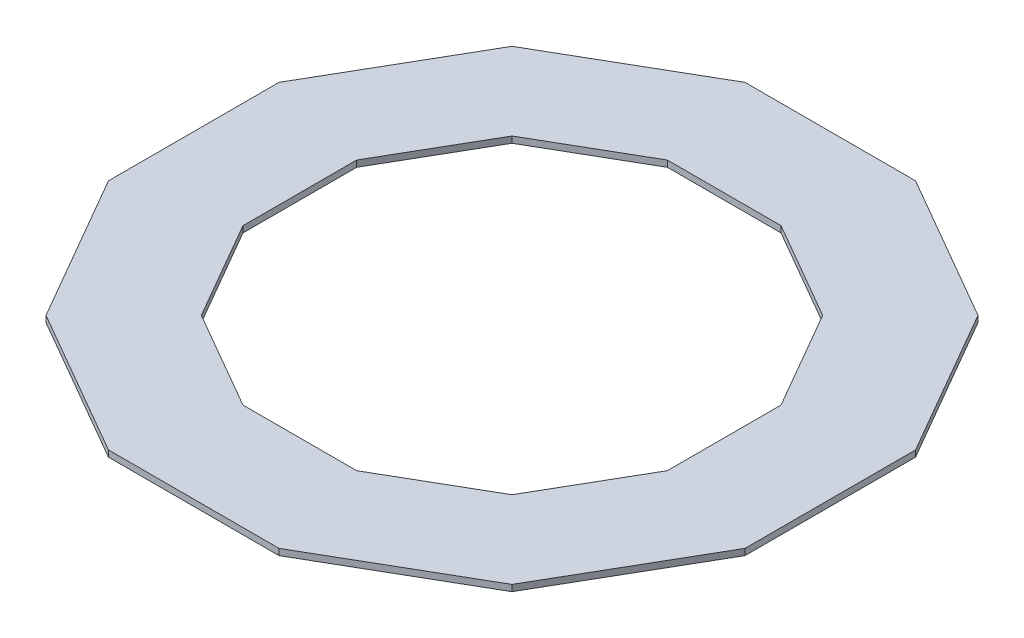
ISO-10303-21;
HEADER;
FILE_DESCRIPTION(('STEP AP214'),'2;1');
FILE_NAME('part.step','',(''),(''),'','','');
FILE_SCHEMA(('AUTOMOTIVE_DESIGN { 1 0 10303 214 1 1 1 1 }'));
ENDSEC;
DATA;
#1=APPLICATION_CONTEXT('core data for automotive mechanical design processes');
#2=APPLICATION_PROTOCOL_DEFINITION('international standard','automotive_design',2000,#1);
#3=PRODUCT_CONTEXT('',#1,'mechanical');
#4=PRODUCT('Part','Part','',(#3));
#5=PRODUCT_RELATED_PRODUCT_CATEGORY('part','',(#4));
#6=PRODUCT_DEFINITION_FORMATION('','',#4);
#7=PRODUCT_DEFINITION_CONTEXT('part definition',#1,'design');
#8=PRODUCT_DEFINITION('design','',#6,#7);
#9=PRODUCT_DEFINITION_SHAPE('','',#8);
#10=(LENGTH_UNIT() NAMED_UNIT(*) SI_UNIT(.MILLI.,.METRE.));
#11=(NAMED_UNIT(*) PLANE_ANGLE_UNIT() SI_UNIT($,.RADIAN.));
#12=(NAMED_UNIT(*) SI_UNIT($,.STERADIAN.) SOLID_ANGLE_UNIT());
#13=UNCERTAINTY_MEASURE_WITH_UNIT(LENGTH_MEASURE(1.E-05),#10,'distance_accuracy_value','');
#14=(GEOMETRIC_REPRESENTATION_CONTEXT(3) GLOBAL_UNCERTAINTY_ASSIGNED_CONTEXT((#13)) GLOBAL_UNIT_ASSIGNED_CONTEXT((#10,
#11,#12)) REPRESENTATION_CONTEXT('',''));
#15=CARTESIAN_POINT('',(0.,0.,0.));
#16=DIRECTION('',(0.,0.,1.));
#17=DIRECTION('',(1.,0.,0.));
#18=AXIS2_PLACEMENT_3D('',#15,#16,#17);
#19=CARTESIAN_POINT('',(0.,-2.921,0.));
#20=DIRECTION('',(0.,1.,0.));
#21=DIRECTION('',(0.,0.,1.));
#22=AXIS2_PLACEMENT_3D('',#19,#20,#21);
#23=PLANE('',#22);
#24=DIRECTION('',(-0.5,0.,-0.866025403784439));
#25=VECTOR('',#24,1.);
#26=CARTESIAN_POINT('',(127.485084689642,-2.921,-73.6035479632271));
#27=LINE('',#26,#25);
#28=CARTESIAN_POINT('',(147.207095926454,-2.921,-39.4440224736242));
#29=VERTEX_POINT('',#28);
#30=CARTESIAN_POINT('',(107.76307345283,-2.921,-107.76307345283));
#31=VERTEX_POINT('',#30);
#32=EDGE_CURVE('E291',#29,#31,#27,.T.);
#33=ORIENTED_EDGE('',*,*,#32,.F.);
#34=DIRECTION('',(0.,0.,-1.));
#35=VECTOR('',#34,1.);
#36=CARTESIAN_POINT('',(147.207095926454,-2.921,0.));
#37=LINE('',#36,#35);
#38=CARTESIAN_POINT('',(147.207095926454,-2.921,39.4440224736242));
#39=VERTEX_POINT('',#38);
#40=EDGE_CURVE('E325',#39,#29,#37,.T.);
#41=ORIENTED_EDGE('',*,*,#40,.F.);
#42=DIRECTION('',(0.5,0.,-0.866025403784439));
#43=VECTOR('',#42,1.);
#44=CARTESIAN_POINT('',(127.485084689642,-2.921,73.6035479632271));
#45=LINE('',#44,#43);
#46=CARTESIAN_POINT('',(107.76307345283,-2.921,107.76307345283));
#47=VERTEX_POINT('',#46);
#48=EDGE_CURVE('E322',#47,#39,#45,.T.);
#49=ORIENTED_EDGE('',*,*,#48,.F.);
#50=DIRECTION('',(0.866025403784439,0.,-0.5));
#51=VECTOR('',#50,1.);
#52=CARTESIAN_POINT('',(73.603547963227,-2.921,127.485084689642));
#53=LINE('',#52,#51);
#54=CARTESIAN_POINT('',(39.4440224736242,-2.921,147.207095926454));
#55=VERTEX_POINT('',#54);
#56=EDGE_CURVE('E319',#55,#47,#53,.T.);
#57=ORIENTED_EDGE('',*,*,#56,.F.);
#58=DIRECTION('',(1.,0.,0.));
#59=VECTOR('',#58,1.);
#60=CARTESIAN_POINT('',(0.,-2.921,147.207095926454));
#61=LINE('',#60,#59);
#62=CARTESIAN_POINT('',(-39.4440224736242,-2.921,147.207095926454));
#63=VERTEX_POINT('',#62);
#64=EDGE_CURVE('E316',#63,#55,#61,.T.);
#65=ORIENTED_EDGE('',*,*,#64,.F.);
#66=DIRECTION('',(0.866025403784439,0.,0.5));
#67=VECTOR('',#66,1.);
#68=CARTESIAN_POINT('',(-73.603547963227,-2.921,127.485084689642));
#69=LINE('',#68,#67);
#70=CARTESIAN_POINT('',(-107.76307345283,-2.921,107.76307345283));
#71=VERTEX_POINT('',#70);
#72=EDGE_CURVE('E313',#71,#63,#69,.T.);
#73=ORIENTED_EDGE('',*,*,#72,.F.);
#74=DIRECTION('',(0.5,0.,0.866025403784439));
#75=VECTOR('',#74,1.);
#76=CARTESIAN_POINT('',(-127.485084689642,-2.921,73.6035479632271));
#77=LINE('',#76,#75);
#78=CARTESIAN_POINT('',(-147.207095926454,-2.921,39.4440224736242));
#79=VERTEX_POINT('',#78);
#80=EDGE_CURVE('E310',#79,#71,#77,.T.);
#81=ORIENTED_EDGE('',*,*,#80,.F.);
#82=DIRECTION('',(0.,0.,1.));
#83=VECTOR('',#82,1.);
#84=CARTESIAN_POINT('',(-147.207095926454,-2.921,0.));
#85=LINE('',#84,#83);
#86=CARTESIAN_POINT('',(-147.207095926454,-2.921,-39.4440224736242));
#87=VERTEX_POINT('',#86);
#88=EDGE_CURVE('E307',#87,#79,#85,.T.);
#89=ORIENTED_EDGE('',*,*,#88,.F.);
#90=DIRECTION('',(-0.5,0.,0.866025403784439));
#91=VECTOR('',#90,1.);
#92=CARTESIAN_POINT('',(-127.485084689642,-2.921,-73.603547963227));
#93=LINE('',#92,#91);
#94=CARTESIAN_POINT('',(-107.76307345283,-2.921,-107.76307345283));
#95=VERTEX_POINT('',#94);
#96=EDGE_CURVE('E304',#95,#87,#93,.T.);
#97=ORIENTED_EDGE('',*,*,#96,.F.);
#98=DIRECTION('',(-0.866025403784439,0.,0.5));
#99=VECTOR('',#98,1.);
#100=CARTESIAN_POINT('',(-73.603547963227,-2.921,-127.485084689642));
#101=LINE('',#100,#99);
#102=CARTESIAN_POINT('',(-39.4440224736242,-2.921,-147.207095926454));
#103=VERTEX_POINT('',#102);
#104=EDGE_CURVE('E301',#103,#95,#101,.T.);
#105=ORIENTED_EDGE('',*,*,#104,.F.);
#106=DIRECTION('',(-1.,0.,0.));
#107=VECTOR('',#106,1.);
#108=CARTESIAN_POINT('',(0.,-2.921,-147.207095926454));
#109=LINE('',#108,#107);
#110=CARTESIAN_POINT('',(39.4440224736242,-2.921,-147.207095926454));
#111=VERTEX_POINT('',#110);
#112=EDGE_CURVE('E298',#111,#103,#109,.T.);
#113=ORIENTED_EDGE('',*,*,#112,.F.);
#114=DIRECTION('',(-0.866025403784439,0.,-0.5));
#115=VECTOR('',#114,1.);
#116=CARTESIAN_POINT('',(73.603547963227,-2.921,-127.485084689642));
#117=LINE('',#116,#115);
#118=EDGE_CURVE('E294',#31,#111,#117,.T.);
#119=ORIENTED_EDGE('',*,*,#118,.F.);
#120=EDGE_LOOP('',(#33,#41,#49,#57,#65,#73,#81,#89,#97,#105,#113,#119));
#121=FACE_BOUND('',#120,.T.);
#122=DIRECTION('',(0.5,0.,-0.866025403784439));
#123=VECTOR('',#122,1.);
#124=CARTESIAN_POINT('',(-84.9900564597613,-2.921,-49.0690319754847));
#125=LINE('',#124,#123);
#126=CARTESIAN_POINT('',(-98.1380639509693,-2.921,-26.2960149824161));
#127=VERTEX_POINT('',#126);
#128=CARTESIAN_POINT('',(-71.8420489685532,-2.921,-71.8420489685532));
#129=VERTEX_POINT('',#128);
#130=EDGE_CURVE('E208',#127,#129,#125,.T.);
#131=ORIENTED_EDGE('',*,*,#130,.F.);
#132=DIRECTION('',(0.,0.,-1.));
#133=VECTOR('',#132,1.);
#134=CARTESIAN_POINT('',(-98.1380639509693,-2.921,0.));
#135=LINE('',#134,#133);
#136=CARTESIAN_POINT('',(-98.1380639509693,-2.921,26.2960149824161));
#137=VERTEX_POINT('',#136);
#138=EDGE_CURVE('E200',#137,#127,#135,.T.);
#139=ORIENTED_EDGE('',*,*,#138,.F.);
#140=DIRECTION('',(-0.5,0.,-0.866025403784439));
#141=VECTOR('',#140,1.);
#142=CARTESIAN_POINT('',(-84.9900564597613,-2.921,49.0690319754847));
#143=LINE('',#142,#141);
#144=CARTESIAN_POINT('',(-71.8420489685532,-2.921,71.8420489685532));
#145=VERTEX_POINT('',#144);
#146=EDGE_CURVE('E207',#145,#137,#143,.T.);
#147=ORIENTED_EDGE('',*,*,#146,.F.);
#148=DIRECTION('',(-0.866025403784439,0.,-0.5));
#149=VECTOR('',#148,1.);
#150=CARTESIAN_POINT('',(-49.0690319754847,-2.921,84.9900564597613));
#151=LINE('',#150,#149);
#152=CARTESIAN_POINT('',(-26.2960149824161,-2.921,98.1380639509694));
#153=VERTEX_POINT('',#152);
#154=EDGE_CURVE('E223',#153,#145,#151,.T.);
#155=ORIENTED_EDGE('',*,*,#154,.F.);
#156=DIRECTION('',(-1.,0.,0.));
#157=VECTOR('',#156,1.);
#158=CARTESIAN_POINT('',(0.,-2.921,98.1380639509694));
#159=LINE('',#158,#157);
#160=CARTESIAN_POINT('',(26.2960149824161,-2.921,98.1380639509694));
#161=VERTEX_POINT('',#160);
#162=EDGE_CURVE('E225',#161,#153,#159,.T.);
#163=ORIENTED_EDGE('',*,*,#162,.F.);
#164=DIRECTION('',(-0.866025403784439,0.,0.5));
#165=VECTOR('',#164,1.);
#166=CARTESIAN_POINT('',(49.0690319754847,-2.921,84.9900564597613));
#167=LINE('',#166,#165);
#168=CARTESIAN_POINT('',(71.8420489685532,-2.921,71.8420489685532));
#169=VERTEX_POINT('',#168);
#170=EDGE_CURVE('E227',#169,#161,#167,.T.);
#171=ORIENTED_EDGE('',*,*,#170,.F.);
#172=DIRECTION('',(-0.5,0.,0.866025403784439));
#173=VECTOR('',#172,1.);
#174=CARTESIAN_POINT('',(84.9900564597613,-2.921,49.0690319754847));
#175=LINE('',#174,#173);
#176=CARTESIAN_POINT('',(98.1380639509694,-2.921,26.2960149824161));
#177=VERTEX_POINT('',#176);
#178=EDGE_CURVE('E229',#177,#169,#175,.T.);
#179=ORIENTED_EDGE('',*,*,#178,.F.);
#180=DIRECTION('',(0.,0.,1.));
#181=VECTOR('',#180,1.);
#182=CARTESIAN_POINT('',(98.1380639509694,-2.921,0.));
#183=LINE('',#182,#181);
#184=CARTESIAN_POINT('',(98.1380639509694,-2.921,-26.2960149824161));
#185=VERTEX_POINT('',#184);
#186=EDGE_CURVE('E231',#185,#177,#183,.T.);
#187=ORIENTED_EDGE('',*,*,#186,.F.);
#188=DIRECTION('',(0.5,0.,0.866025403784439));
#189=VECTOR('',#188,1.);
#190=CARTESIAN_POINT('',(84.9900564597613,-2.921,-49.0690319754847));
#191=LINE('',#190,#189);
#192=CARTESIAN_POINT('',(71.8420489685532,-2.921,-71.8420489685532));
#193=VERTEX_POINT('',#192);
#194=EDGE_CURVE('E233',#193,#185,#191,.T.);
#195=ORIENTED_EDGE('',*,*,#194,.F.);
#196=DIRECTION('',(0.866025403784439,0.,0.5));
#197=VECTOR('',#196,1.);
#198=CARTESIAN_POINT('',(49.0690319754847,-2.921,-84.9900564597613));
#199=LINE('',#198,#197);
#200=CARTESIAN_POINT('',(26.2960149824161,-2.921,-98.1380639509694));
#201=VERTEX_POINT('',#200);
#202=EDGE_CURVE('E235',#201,#193,#199,.T.);
#203=ORIENTED_EDGE('',*,*,#202,.F.);
#204=DIRECTION('',(1.,0.,0.));
#205=VECTOR('',#204,1.);
#206=CARTESIAN_POINT('',(0.,-2.921,-98.1380639509694));
#207=LINE('',#206,#205);
#208=CARTESIAN_POINT('',(-26.2960149824161,-2.921,-98.1380639509694));
#209=VERTEX_POINT('',#208);
#210=EDGE_CURVE('E237',#209,#201,#207,.T.);
#211=ORIENTED_EDGE('',*,*,#210,.F.);
#212=DIRECTION('',(0.866025403784439,0.,-0.5));
#213=VECTOR('',#212,1.);
#214=CARTESIAN_POINT('',(-49.0690319754847,-2.921,-84.9900564597613));
#215=LINE('',#214,#213);
#216=EDGE_CURVE('E212',#129,#209,#215,.T.);
#217=ORIENTED_EDGE('',*,*,#216,.F.);
#218=EDGE_LOOP('',(#131,#139,#147,#155,#163,#171,#179,#187,#195,#203,#211,#217));
#219=FACE_BOUND('',#218,.T.);
#220=ADVANCED_FACE('F38',(#121,#219),#23,.F.);
#221=CARTESIAN_POINT('',(0.,0.,0.));
#222=DIRECTION('',(0.,1.,0.));
#223=DIRECTION('',(0.,0.,1.));
#224=AXIS2_PLACEMENT_3D('',#221,#222,#223);
#225=PLANE('',#224);
#226=DIRECTION('',(-0.5,0.,-0.866025403784439));
#227=VECTOR('',#226,1.);
#228=CARTESIAN_POINT('',(127.485084689642,0.,-73.6035479632271));
#229=LINE('',#228,#227);
#230=CARTESIAN_POINT('',(147.207095926454,0.,-39.4440224736242));
#231=VERTEX_POINT('',#230);
#232=CARTESIAN_POINT('',(107.76307345283,0.,-107.76307345283));
#233=VERTEX_POINT('',#232);
#234=EDGE_CURVE('E271',#231,#233,#229,.T.);
#235=ORIENTED_EDGE('',*,*,#234,.T.);
#236=DIRECTION('',(-0.866025403784439,0.,-0.5));
#237=VECTOR('',#236,1.);
#238=CARTESIAN_POINT('',(73.603547963227,0.,-127.485084689642));
#239=LINE('',#238,#237);
#240=CARTESIAN_POINT('',(39.4440224736242,0.,-147.207095926454));
#241=VERTEX_POINT('',#240);
#242=EDGE_CURVE('E330',#233,#241,#239,.T.);
#243=ORIENTED_EDGE('',*,*,#242,.T.);
#244=DIRECTION('',(-1.,0.,0.));
#245=VECTOR('',#244,1.);
#246=CARTESIAN_POINT('',(0.,0.,-147.207095926454));
#247=LINE('',#246,#245);
#248=CARTESIAN_POINT('',(-39.4440224736242,0.,-147.207095926454));
#249=VERTEX_POINT('',#248);
#250=EDGE_CURVE('E333',#241,#249,#247,.T.);
#251=ORIENTED_EDGE('',*,*,#250,.T.);
#252=DIRECTION('',(-0.866025403784439,0.,0.5));
#253=VECTOR('',#252,1.);
#254=CARTESIAN_POINT('',(-73.603547963227,0.,-127.485084689642));
#255=LINE('',#254,#253);
#256=CARTESIAN_POINT('',(-107.76307345283,0.,-107.76307345283));
#257=VERTEX_POINT('',#256);
#258=EDGE_CURVE('E336',#249,#257,#255,.T.);
#259=ORIENTED_EDGE('',*,*,#258,.T.);
#260=DIRECTION('',(-0.5,0.,0.866025403784439));
#261=VECTOR('',#260,1.);
#262=CARTESIAN_POINT('',(-127.485084689642,0.,-73.603547963227));
#263=LINE('',#262,#261);
#264=CARTESIAN_POINT('',(-147.207095926454,0.,-39.4440224736242));
#265=VERTEX_POINT('',#264);
#266=EDGE_CURVE('E339',#257,#265,#263,.T.);
#267=ORIENTED_EDGE('',*,*,#266,.T.);
#268=DIRECTION('',(0.,0.,1.));
#269=VECTOR('',#268,1.);
#270=CARTESIAN_POINT('',(-147.207095926454,0.,0.));
#271=LINE('',#270,#269);
#272=CARTESIAN_POINT('',(-147.207095926454,0.,39.4440224736242));
#273=VERTEX_POINT('',#272);
#274=EDGE_CURVE('E342',#265,#273,#271,.T.);
#275=ORIENTED_EDGE('',*,*,#274,.T.);
#276=DIRECTION('',(0.5,0.,0.866025403784439));
#277=VECTOR('',#276,1.);
#278=CARTESIAN_POINT('',(-127.485084689642,0.,73.6035479632271));
#279=LINE('',#278,#277);
#280=CARTESIAN_POINT('',(-107.76307345283,0.,107.76307345283));
#281=VERTEX_POINT('',#280);
#282=EDGE_CURVE('E345',#273,#281,#279,.T.);
#283=ORIENTED_EDGE('',*,*,#282,.T.);
#284=DIRECTION('',(0.866025403784439,0.,0.5));
#285=VECTOR('',#284,1.);
#286=CARTESIAN_POINT('',(-73.603547963227,0.,127.485084689642));
#287=LINE('',#286,#285);
#288=CARTESIAN_POINT('',(-39.4440224736242,0.,147.207095926454));
#289=VERTEX_POINT('',#288);
#290=EDGE_CURVE('E348',#281,#289,#287,.T.);
#291=ORIENTED_EDGE('',*,*,#290,.T.);
#292=DIRECTION('',(1.,0.,0.));
#293=VECTOR('',#292,1.);
#294=CARTESIAN_POINT('',(0.,0.,147.207095926454));
#295=LINE('',#294,#293);
#296=CARTESIAN_POINT('',(39.4440224736242,0.,147.207095926454));
#297=VERTEX_POINT('',#296);
#298=EDGE_CURVE('E351',#289,#297,#295,.T.);
#299=ORIENTED_EDGE('',*,*,#298,.T.);
#300=DIRECTION('',(0.866025403784439,0.,-0.5));
#301=VECTOR('',#300,1.);
#302=CARTESIAN_POINT('',(73.603547963227,0.,127.485084689642));
#303=LINE('',#302,#301);
#304=CARTESIAN_POINT('',(107.76307345283,0.,107.76307345283));
#305=VERTEX_POINT('',#304);
#306=EDGE_CURVE('E354',#297,#305,#303,.T.);
#307=ORIENTED_EDGE('',*,*,#306,.T.);
#308=DIRECTION('',(0.5,0.,-0.866025403784439));
#309=VECTOR('',#308,1.);
#310=CARTESIAN_POINT('',(127.485084689642,0.,73.6035479632271));
#311=LINE('',#310,#309);
#312=CARTESIAN_POINT('',(147.207095926454,0.,39.4440224736242));
#313=VERTEX_POINT('',#312);
#314=EDGE_CURVE('E357',#305,#313,#311,.T.);
#315=ORIENTED_EDGE('',*,*,#314,.T.);
#316=DIRECTION('',(0.,0.,-1.));
#317=VECTOR('',#316,1.);
#318=CARTESIAN_POINT('',(147.207095926454,0.,0.));
#319=LINE('',#318,#317);
#320=EDGE_CURVE('E295',#313,#231,#319,.T.);
#321=ORIENTED_EDGE('',*,*,#320,.T.);
#322=EDGE_LOOP('',(#235,#243,#251,#259,#267,#275,#283,#291,#299,#307,#315,#321));
#323=FACE_BOUND('',#322,.T.);
#324=DIRECTION('',(0.,0.,-1.));
#325=VECTOR('',#324,1.);
#326=CARTESIAN_POINT('',(-98.1380639509693,0.,0.));
#327=LINE('',#326,#325);
#328=CARTESIAN_POINT('',(-98.1380639509693,0.,26.2960149824161));
#329=VERTEX_POINT('',#328);
#330=CARTESIAN_POINT('',(-98.1380639509693,0.,-26.2960149824161));
#331=VERTEX_POINT('',#330);
#332=EDGE_CURVE('E241',#329,#331,#327,.T.);
#333=ORIENTED_EDGE('',*,*,#332,.T.);
#334=DIRECTION('',(0.5,0.,-0.866025403784439));
#335=VECTOR('',#334,1.);
#336=CARTESIAN_POINT('',(-84.9900564597613,0.,-49.0690319754847));
#337=LINE('',#336,#335);
#338=CARTESIAN_POINT('',(-71.8420489685532,0.,-71.8420489685532));
#339=VERTEX_POINT('',#338);
#340=EDGE_CURVE('E63',#331,#339,#337,.T.);
#341=ORIENTED_EDGE('',*,*,#340,.T.);
#342=DIRECTION('',(0.866025403784439,0.,-0.5));
#343=VECTOR('',#342,1.);
#344=CARTESIAN_POINT('',(-49.0690319754847,0.,-84.9900564597613));
#345=LINE('',#344,#343);
#346=CARTESIAN_POINT('',(-26.2960149824161,0.,-98.1380639509694));
#347=VERTEX_POINT('',#346);
#348=EDGE_CURVE('E216',#339,#347,#345,.T.);
#349=ORIENTED_EDGE('',*,*,#348,.T.);
#350=DIRECTION('',(1.,0.,0.));
#351=VECTOR('',#350,1.);
#352=CARTESIAN_POINT('',(0.,0.,-98.1380639509694));
#353=LINE('',#352,#351);
#354=CARTESIAN_POINT('',(26.2960149824161,0.,-98.1380639509694));
#355=VERTEX_POINT('',#354);
#356=EDGE_CURVE('E219',#347,#355,#353,.T.);
#357=ORIENTED_EDGE('',*,*,#356,.T.);
#358=DIRECTION('',(0.866025403784439,0.,0.5));
#359=VECTOR('',#358,1.);
#360=CARTESIAN_POINT('',(49.0690319754847,0.,-84.9900564597613));
#361=LINE('',#360,#359);
#362=CARTESIAN_POINT('',(71.8420489685532,0.,-71.8420489685532));
#363=VERTEX_POINT('',#362);
#364=EDGE_CURVE('E264',#355,#363,#361,.T.);
#365=ORIENTED_EDGE('',*,*,#364,.T.);
#366=DIRECTION('',(0.5,0.,0.866025403784439));
#367=VECTOR('',#366,1.);
#368=CARTESIAN_POINT('',(84.9900564597613,0.,-49.0690319754847));
#369=LINE('',#368,#367);
#370=CARTESIAN_POINT('',(98.1380639509694,0.,-26.2960149824161));
#371=VERTEX_POINT('',#370);
#372=EDGE_CURVE('E261',#363,#371,#369,.T.);
#373=ORIENTED_EDGE('',*,*,#372,.T.);
#374=DIRECTION('',(0.,0.,1.));
#375=VECTOR('',#374,1.);
#376=CARTESIAN_POINT('',(98.1380639509694,0.,0.));
#377=LINE('',#376,#375);
#378=CARTESIAN_POINT('',(98.1380639509694,0.,26.2960149824161));
#379=VERTEX_POINT('',#378);
#380=EDGE_CURVE('E258',#371,#379,#377,.T.);
#381=ORIENTED_EDGE('',*,*,#380,.T.);
#382=DIRECTION('',(-0.5,0.,0.866025403784439));
#383=VECTOR('',#382,1.);
#384=CARTESIAN_POINT('',(84.9900564597613,0.,49.0690319754847));
#385=LINE('',#384,#383);
#386=CARTESIAN_POINT('',(71.8420489685532,0.,71.8420489685532));
#387=VERTEX_POINT('',#386);
#388=EDGE_CURVE('E255',#379,#387,#385,.T.);
#389=ORIENTED_EDGE('',*,*,#388,.T.);
#390=DIRECTION('',(-0.866025403784439,0.,0.5));
#391=VECTOR('',#390,1.);
#392=CARTESIAN_POINT('',(49.0690319754847,0.,84.9900564597613));
#393=LINE('',#392,#391);
#394=CARTESIAN_POINT('',(26.2960149824161,0.,98.1380639509694));
#395=VERTEX_POINT('',#394);
#396=EDGE_CURVE('E252',#387,#395,#393,.T.);
#397=ORIENTED_EDGE('',*,*,#396,.T.);
#398=DIRECTION('',(-1.,0.,0.));
#399=VECTOR('',#398,1.);
#400=CARTESIAN_POINT('',(0.,0.,98.1380639509694));
#401=LINE('',#400,#399);
#402=CARTESIAN_POINT('',(-26.2960149824161,0.,98.1380639509694));
#403=VERTEX_POINT('',#402);
#404=EDGE_CURVE('E249',#395,#403,#401,.T.);
#405=ORIENTED_EDGE('',*,*,#404,.T.);
#406=DIRECTION('',(-0.866025403784439,0.,-0.5));
#407=VECTOR('',#406,1.);
#408=CARTESIAN_POINT('',(-49.0690319754847,0.,84.9900564597613));
#409=LINE('',#408,#407);
#410=CARTESIAN_POINT('',(-71.8420489685532,0.,71.8420489685532));
#411=VERTEX_POINT('',#410);
#412=EDGE_CURVE('E246',#403,#411,#409,.T.);
#413=ORIENTED_EDGE('',*,*,#412,.T.);
#414=DIRECTION('',(-0.5,0.,-0.866025403784439));
#415=VECTOR('',#414,1.);
#416=CARTESIAN_POINT('',(-84.9900564597613,0.,49.0690319754847));
#417=LINE('',#416,#415);
#418=EDGE_CURVE('E243',#411,#329,#417,.T.);
#419=ORIENTED_EDGE('',*,*,#418,.T.);
#420=EDGE_LOOP('',(#333,#341,#349,#357,#365,#373,#381,#389,#397,#405,#413,#419));
#421=FACE_BOUND('',#420,.T.);
#422=ADVANCED_FACE('F388',(#323,#421),#225,.T.);
#423=CARTESIAN_POINT('',(127.485084689642,-2.921,-73.6035479632271));
#424=DIRECTION('',(0.866025403784439,0.,-0.5));
#425=DIRECTION('',(-0.5,0.,-0.866025403784439));
#426=AXIS2_PLACEMENT_3D('',#423,#424,#425);
#427=PLANE('',#426);
#428=ORIENTED_EDGE('',*,*,#234,.F.);
#429=DIRECTION('',(0.,1.,0.));
#430=VECTOR('',#429,1.);
#431=CARTESIAN_POINT('',(147.207095926454,-2.921,-39.4440224736242));
#432=LINE('',#431,#430);
#433=EDGE_CURVE('E11',#29,#231,#432,.T.);
#434=ORIENTED_EDGE('',*,*,#433,.F.);
#435=ORIENTED_EDGE('',*,*,#32,.T.);
#436=DIRECTION('',(0.,1.,0.));
#437=VECTOR('',#436,1.);
#438=CARTESIAN_POINT('',(107.76307345283,-2.921,-107.76307345283));
#439=LINE('',#438,#437);
#440=EDGE_CURVE('E42',#31,#233,#439,.T.);
#441=ORIENTED_EDGE('',*,*,#440,.T.);
#442=EDGE_LOOP('',(#428,#434,#435,#441));
#443=FACE_BOUND('',#442,.T.);
#444=ADVANCED_FACE('F40',(#443),#427,.T.);
#445=CARTESIAN_POINT('',(147.207095926454,-2.921,0.));
#446=DIRECTION('',(1.,0.,0.));
#447=DIRECTION('',(0.,0.,-1.));
#448=AXIS2_PLACEMENT_3D('',#445,#446,#447);
#449=PLANE('',#448);
#450=ORIENTED_EDGE('',*,*,#320,.F.);
#451=DIRECTION('',(0.,1.,0.));
#452=VECTOR('',#451,1.);
#453=CARTESIAN_POINT('',(147.207095926454,-2.921,39.4440224736242));
#454=LINE('',#453,#452);
#455=EDGE_CURVE('E47',#39,#313,#454,.T.);
#456=ORIENTED_EDGE('',*,*,#455,.F.);
#457=ORIENTED_EDGE('',*,*,#40,.T.);
#458=ORIENTED_EDGE('',*,*,#433,.T.);
#459=EDGE_LOOP('',(#450,#456,#457,#458));
#460=FACE_BOUND('',#459,.T.);
#461=ADVANCED_FACE('F393',(#460),#449,.T.);
#462=CARTESIAN_POINT('',(127.485084689642,-2.921,73.6035479632271));
#463=DIRECTION('',(0.866025403784439,0.,0.5));
#464=DIRECTION('',(0.5,0.,-0.866025403784439));
#465=AXIS2_PLACEMENT_3D('',#462,#463,#464);
#466=PLANE('',#465);
#467=ORIENTED_EDGE('',*,*,#314,.F.);
#468=DIRECTION('',(0.,1.,0.));
#469=VECTOR('',#468,1.);
#470=CARTESIAN_POINT('',(107.76307345283,-2.921,107.76307345283));
#471=LINE('',#470,#469);
#472=EDGE_CURVE('E363',#47,#305,#471,.T.);
#473=ORIENTED_EDGE('',*,*,#472,.F.);
#474=ORIENTED_EDGE('',*,*,#48,.T.);
#475=ORIENTED_EDGE('',*,*,#455,.T.);
#476=EDGE_LOOP('',(#467,#473,#474,#475));
#477=FACE_BOUND('',#476,.T.);
#478=ADVANCED_FACE('F429',(#477),#466,.T.);
#479=CARTESIAN_POINT('',(73.603547963227,-2.921,127.485084689642));
#480=DIRECTION('',(0.5,0.,0.866025403784439));
#481=DIRECTION('',(0.866025403784439,0.,-0.5));
#482=AXIS2_PLACEMENT_3D('',#479,#480,#481);
#483=PLANE('',#482);
#484=ORIENTED_EDGE('',*,*,#306,.F.);
#485=DIRECTION('',(0.,1.,0.));
#486=VECTOR('',#485,1.);
#487=CARTESIAN_POINT('',(39.4440224736242,-2.921,147.207095926454));
#488=LINE('',#487,#486);
#489=EDGE_CURVE('E365',#55,#297,#488,.T.);
#490=ORIENTED_EDGE('',*,*,#489,.F.);
#491=ORIENTED_EDGE('',*,*,#56,.T.);
#492=ORIENTED_EDGE('',*,*,#472,.T.);
#493=EDGE_LOOP('',(#484,#490,#491,#492));
#494=FACE_BOUND('',#493,.T.);
#495=ADVANCED_FACE('F426',(#494),#483,.T.);
#496=CARTESIAN_POINT('',(0.,-2.921,147.207095926454));
#497=DIRECTION('',(0.,0.,1.));
#498=DIRECTION('',(1.,0.,0.));
#499=AXIS2_PLACEMENT_3D('',#496,#497,#498);
#500=PLANE('',#499);
#501=ORIENTED_EDGE('',*,*,#298,.F.);
#502=DIRECTION('',(0.,1.,0.));
#503=VECTOR('',#502,1.);
#504=CARTESIAN_POINT('',(-39.4440224736242,-2.921,147.207095926454));
#505=LINE('',#504,#503);
#506=EDGE_CURVE('E367',#63,#289,#505,.T.);
#507=ORIENTED_EDGE('',*,*,#506,.F.);
#508=ORIENTED_EDGE('',*,*,#64,.T.);
#509=ORIENTED_EDGE('',*,*,#489,.T.);
#510=EDGE_LOOP('',(#501,#507,#508,#509));
#511=FACE_BOUND('',#510,.T.);
#512=ADVANCED_FACE('F423',(#511),#500,.T.);
#513=CARTESIAN_POINT('',(-73.603547963227,-2.921,127.485084689642));
#514=DIRECTION('',(-0.5,0.,0.866025403784439));
#515=DIRECTION('',(0.866025403784439,0.,0.5));
#516=AXIS2_PLACEMENT_3D('',#513,#514,#515);
#517=PLANE('',#516);
#518=ORIENTED_EDGE('',*,*,#290,.F.);
#519=DIRECTION('',(0.,1.,0.));
#520=VECTOR('',#519,1.);
#521=CARTESIAN_POINT('',(-107.76307345283,-2.921,107.76307345283));
#522=LINE('',#521,#520);
#523=EDGE_CURVE('E369',#71,#281,#522,.T.);
#524=ORIENTED_EDGE('',*,*,#523,.F.);
#525=ORIENTED_EDGE('',*,*,#72,.T.);
#526=ORIENTED_EDGE('',*,*,#506,.T.);
#527=EDGE_LOOP('',(#518,#524,#525,#526));
#528=FACE_BOUND('',#527,.T.);
#529=ADVANCED_FACE('F419',(#528),#517,.T.);
#530=CARTESIAN_POINT('',(-127.485084689642,-2.921,73.6035479632271));
#531=DIRECTION('',(-0.866025403784439,0.,0.5));
#532=DIRECTION('',(0.5,0.,0.866025403784439));
#533=AXIS2_PLACEMENT_3D('',#530,#531,#532);
#534=PLANE('',#533);
#535=ORIENTED_EDGE('',*,*,#282,.F.);
#536=DIRECTION('',(0.,1.,0.));
#537=VECTOR('',#536,1.);
#538=CARTESIAN_POINT('',(-147.207095926454,-2.921,39.4440224736242));
#539=LINE('',#538,#537);
#540=EDGE_CURVE('E371',#79,#273,#539,.T.);
#541=ORIENTED_EDGE('',*,*,#540,.F.);
#542=ORIENTED_EDGE('',*,*,#80,.T.);
#543=ORIENTED_EDGE('',*,*,#523,.T.);
#544=EDGE_LOOP('',(#535,#541,#542,#543));
#545=FACE_BOUND('',#544,.T.);
#546=ADVANCED_FACE('F415',(#545),#534,.T.);
#547=CARTESIAN_POINT('',(-147.207095926454,-2.921,0.));
#548=DIRECTION('',(-1.,0.,0.));
#549=DIRECTION('',(0.,0.,1.));
#550=AXIS2_PLACEMENT_3D('',#547,#548,#549);
#551=PLANE('',#550);
#552=ORIENTED_EDGE('',*,*,#274,.F.);
#553=DIRECTION('',(0.,1.,0.));
#554=VECTOR('',#553,1.);
#555=CARTESIAN_POINT('',(-147.207095926454,-2.921,-39.4440224736242));
#556=LINE('',#555,#554);
#557=EDGE_CURVE('E373',#87,#265,#556,.T.);
#558=ORIENTED_EDGE('',*,*,#557,.F.);
#559=ORIENTED_EDGE('',*,*,#88,.T.);
#560=ORIENTED_EDGE('',*,*,#540,.T.);
#561=EDGE_LOOP('',(#552,#558,#559,#560));
#562=FACE_BOUND('',#561,.T.);
#563=ADVANCED_FACE('F411',(#562),#551,.T.);
#564=CARTESIAN_POINT('',(-127.485084689642,-2.921,-73.603547963227));
#565=DIRECTION('',(-0.866025403784439,0.,-0.5));
#566=DIRECTION('',(-0.5,0.,0.866025403784439));
#567=AXIS2_PLACEMENT_3D('',#564,#565,#566);
#568=PLANE('',#567);
#569=ORIENTED_EDGE('',*,*,#266,.F.);
#570=DIRECTION('',(0.,1.,0.));
#571=VECTOR('',#570,1.);
#572=CARTESIAN_POINT('',(-107.76307345283,-2.921,-107.76307345283));
#573=LINE('',#572,#571);
#574=EDGE_CURVE('E375',#95,#257,#573,.T.);
#575=ORIENTED_EDGE('',*,*,#574,.F.);
#576=ORIENTED_EDGE('',*,*,#96,.T.);
#577=ORIENTED_EDGE('',*,*,#557,.T.);
#578=EDGE_LOOP('',(#569,#575,#576,#577));
#579=FACE_BOUND('',#578,.T.);
#580=ADVANCED_FACE('F407',(#579),#568,.T.);
#581=CARTESIAN_POINT('',(-73.603547963227,-2.921,-127.485084689642));
#582=DIRECTION('',(-0.5,0.,-0.866025403784439));
#583=DIRECTION('',(-0.866025403784439,0.,0.5));
#584=AXIS2_PLACEMENT_3D('',#581,#582,#583);
#585=PLANE('',#584);
#586=ORIENTED_EDGE('',*,*,#258,.F.);
#587=DIRECTION('',(0.,1.,0.));
#588=VECTOR('',#587,1.);
#589=CARTESIAN_POINT('',(-39.4440224736242,-2.921,-147.207095926454));
#590=LINE('',#589,#588);
#591=EDGE_CURVE('E377',#103,#249,#590,.T.);
#592=ORIENTED_EDGE('',*,*,#591,.F.);
#593=ORIENTED_EDGE('',*,*,#104,.T.);
#594=ORIENTED_EDGE('',*,*,#574,.T.);
#595=EDGE_LOOP('',(#586,#592,#593,#594));
#596=FACE_BOUND('',#595,.T.);
#597=ADVANCED_FACE('F405',(#596),#585,.T.);
#598=CARTESIAN_POINT('',(0.,-2.921,-147.207095926454));
#599=DIRECTION('',(0.,0.,-1.));
#600=DIRECTION('',(-1.,0.,0.));
#601=AXIS2_PLACEMENT_3D('',#598,#599,#600);
#602=PLANE('',#601);
#603=ORIENTED_EDGE('',*,*,#250,.F.);
#604=DIRECTION('',(0.,1.,0.));
#605=VECTOR('',#604,1.);
#606=CARTESIAN_POINT('',(39.4440224736242,-2.921,-147.207095926454));
#607=LINE('',#606,#605);
#608=EDGE_CURVE('E378',#111,#241,#607,.T.);
#609=ORIENTED_EDGE('',*,*,#608,.F.);
#610=ORIENTED_EDGE('',*,*,#112,.T.);
#611=ORIENTED_EDGE('',*,*,#591,.T.);
#612=EDGE_LOOP('',(#603,#609,#610,#611));
#613=FACE_BOUND('',#612,.T.);
#614=ADVANCED_FACE('F401',(#613),#602,.T.);
#615=CARTESIAN_POINT('',(73.603547963227,-2.921,-127.485084689642));
#616=DIRECTION('',(0.5,0.,-0.866025403784439));
#617=DIRECTION('',(-0.866025403784439,0.,-0.5));
#618=AXIS2_PLACEMENT_3D('',#615,#616,#617);
#619=PLANE('',#618);
#620=ORIENTED_EDGE('',*,*,#242,.F.);
#621=ORIENTED_EDGE('',*,*,#440,.F.);
#622=ORIENTED_EDGE('',*,*,#118,.T.);
#623=ORIENTED_EDGE('',*,*,#608,.T.);
#624=EDGE_LOOP('',(#620,#621,#622,#623));
#625=FACE_BOUND('',#624,.T.);
#626=ADVANCED_FACE('F386',(#625),#619,.T.);
#627=CARTESIAN_POINT('',(-84.9900564597613,-2.921,-49.0690319754847));
#628=DIRECTION('',(0.866025403784439,0.,0.5));
#629=DIRECTION('',(0.5,0.,-0.866025403784439));
#630=AXIS2_PLACEMENT_3D('',#627,#628,#629);
#631=PLANE('',#630);
#632=ORIENTED_EDGE('',*,*,#340,.F.);
#633=DIRECTION('',(0.,1.,0.));
#634=VECTOR('',#633,1.);
#635=CARTESIAN_POINT('',(-98.1380639509693,-2.921,-26.2960149824161));
#636=LINE('',#635,#634);
#637=EDGE_CURVE('E202',#127,#331,#636,.T.);
#638=ORIENTED_EDGE('',*,*,#637,.F.);
#639=ORIENTED_EDGE('',*,*,#130,.T.);
#640=DIRECTION('',(0.,1.,0.));
#641=VECTOR('',#640,1.);
#642=CARTESIAN_POINT('',(-71.8420489685532,-2.921,-71.8420489685532));
#643=LINE('',#642,#641);
#644=EDGE_CURVE('E269',#129,#339,#643,.T.);
#645=ORIENTED_EDGE('',*,*,#644,.T.);
#646=EDGE_LOOP('',(#632,#638,#639,#645));
#647=FACE_BOUND('',#646,.T.);
#648=ADVANCED_FACE('F210',(#647),#631,.T.);
#649=CARTESIAN_POINT('',(-49.0690319754847,-2.921,-84.9900564597613));
#650=DIRECTION('',(0.5,0.,0.866025403784439));
#651=DIRECTION('',(0.866025403784438,0.,-0.5));
#652=AXIS2_PLACEMENT_3D('',#649,#650,#651);
#653=PLANE('',#652);
#654=ORIENTED_EDGE('',*,*,#348,.F.);
#655=ORIENTED_EDGE('',*,*,#644,.F.);
#656=ORIENTED_EDGE('',*,*,#216,.T.);
#657=DIRECTION('',(0.,1.,0.));
#658=VECTOR('',#657,1.);
#659=CARTESIAN_POINT('',(-26.2960149824161,-2.921,-98.1380639509694));
#660=LINE('',#659,#658);
#661=EDGE_CURVE('E272',#209,#347,#660,.T.);
#662=ORIENTED_EDGE('',*,*,#661,.T.);
#663=EDGE_LOOP('',(#654,#655,#656,#662));
#664=FACE_BOUND('',#663,.T.);
#665=ADVANCED_FACE('F447',(#664),#653,.T.);
#666=CARTESIAN_POINT('',(0.,-2.921,-98.1380639509694));
#667=DIRECTION('',(0.,0.,1.));
#668=DIRECTION('',(1.,0.,0.));
#669=AXIS2_PLACEMENT_3D('',#666,#667,#668);
#670=PLANE('',#669);
#671=ORIENTED_EDGE('',*,*,#356,.F.);
#672=ORIENTED_EDGE('',*,*,#661,.F.);
#673=ORIENTED_EDGE('',*,*,#210,.T.);
#674=DIRECTION('',(0.,1.,0.));
#675=VECTOR('',#674,1.);
#676=CARTESIAN_POINT('',(26.2960149824161,-2.921,-98.1380639509694));
#677=LINE('',#676,#675);
#678=EDGE_CURVE('E274',#201,#355,#677,.T.);
#679=ORIENTED_EDGE('',*,*,#678,.T.);
#680=EDGE_LOOP('',(#671,#672,#673,#679));
#681=FACE_BOUND('',#680,.T.);
#682=ADVANCED_FACE('F481',(#681),#670,.T.);
#683=CARTESIAN_POINT('',(49.0690319754847,-2.921,-84.9900564597613));
#684=DIRECTION('',(-0.5,0.,0.866025403784439));
#685=DIRECTION('',(0.866025403784439,0.,0.5));
#686=AXIS2_PLACEMENT_3D('',#683,#684,#685);
#687=PLANE('',#686);
#688=ORIENTED_EDGE('',*,*,#364,.F.);
#689=ORIENTED_EDGE('',*,*,#678,.F.);
#690=ORIENTED_EDGE('',*,*,#202,.T.);
#691=DIRECTION('',(0.,1.,0.));
#692=VECTOR('',#691,1.);
#693=CARTESIAN_POINT('',(71.8420489685532,-2.921,-71.8420489685532));
#694=LINE('',#693,#692);
#695=EDGE_CURVE('E276',#193,#363,#694,.T.);
#696=ORIENTED_EDGE('',*,*,#695,.T.);
#697=EDGE_LOOP('',(#688,#689,#690,#696));
#698=FACE_BOUND('',#697,.T.);
#699=ADVANCED_FACE('F477',(#698),#687,.T.);
#700=CARTESIAN_POINT('',(84.9900564597613,-2.921,-49.0690319754847));
#701=DIRECTION('',(-0.866025403784439,0.,0.5));
#702=DIRECTION('',(0.5,0.,0.866025403784438));
#703=AXIS2_PLACEMENT_3D('',#700,#701,#702);
#704=PLANE('',#703);
#705=ORIENTED_EDGE('',*,*,#372,.F.);
#706=ORIENTED_EDGE('',*,*,#695,.F.);
#707=ORIENTED_EDGE('',*,*,#194,.T.);
#708=DIRECTION('',(0.,1.,0.));
#709=VECTOR('',#708,1.);
#710=CARTESIAN_POINT('',(98.1380639509694,-2.921,-26.2960149824161));
#711=LINE('',#710,#709);
#712=EDGE_CURVE('E278',#185,#371,#711,.T.);
#713=ORIENTED_EDGE('',*,*,#712,.T.);
#714=EDGE_LOOP('',(#705,#706,#707,#713));
#715=FACE_BOUND('',#714,.T.);
#716=ADVANCED_FACE('F473',(#715),#704,.T.);
#717=CARTESIAN_POINT('',(98.1380639509694,-2.921,0.));
#718=DIRECTION('',(-1.,0.,0.));
#719=DIRECTION('',(0.,0.,1.));
#720=AXIS2_PLACEMENT_3D('',#717,#718,#719);
#721=PLANE('',#720);
#722=ORIENTED_EDGE('',*,*,#380,.F.);
#723=ORIENTED_EDGE('',*,*,#712,.F.);
#724=ORIENTED_EDGE('',*,*,#186,.T.);
#725=DIRECTION('',(0.,1.,0.));
#726=VECTOR('',#725,1.);
#727=CARTESIAN_POINT('',(98.1380639509694,-2.921,26.2960149824161));
#728=LINE('',#727,#726);
#729=EDGE_CURVE('E280',#177,#379,#728,.T.);
#730=ORIENTED_EDGE('',*,*,#729,.T.);
#731=EDGE_LOOP('',(#722,#723,#724,#730));
#732=FACE_BOUND('',#731,.T.);
#733=ADVANCED_FACE('F469',(#732),#721,.T.);
#734=CARTESIAN_POINT('',(84.9900564597613,-2.921,49.0690319754847));
#735=DIRECTION('',(-0.866025403784439,0.,-0.5));
#736=DIRECTION('',(-0.5,0.,0.866025403784438));
#737=AXIS2_PLACEMENT_3D('',#734,#735,#736);
#738=PLANE('',#737);
#739=ORIENTED_EDGE('',*,*,#388,.F.);
#740=ORIENTED_EDGE('',*,*,#729,.F.);
#741=ORIENTED_EDGE('',*,*,#178,.T.);
#742=DIRECTION('',(0.,1.,0.));
#743=VECTOR('',#742,1.);
#744=CARTESIAN_POINT('',(71.8420489685532,-2.921,71.8420489685532));
#745=LINE('',#744,#743);
#746=EDGE_CURVE('E282',#169,#387,#745,.T.);
#747=ORIENTED_EDGE('',*,*,#746,.T.);
#748=EDGE_LOOP('',(#739,#740,#741,#747));
#749=FACE_BOUND('',#748,.T.);
#750=ADVANCED_FACE('F465',(#749),#738,.T.);
#751=CARTESIAN_POINT('',(49.0690319754847,-2.921,84.9900564597613));
#752=DIRECTION('',(-0.5,0.,-0.866025403784439));
#753=DIRECTION('',(-0.866025403784438,0.,0.5));
#754=AXIS2_PLACEMENT_3D('',#751,#752,#753);
#755=PLANE('',#754);
#756=ORIENTED_EDGE('',*,*,#396,.F.);
#757=ORIENTED_EDGE('',*,*,#746,.F.);
#758=ORIENTED_EDGE('',*,*,#170,.T.);
#759=DIRECTION('',(0.,1.,0.));
#760=VECTOR('',#759,1.);
#761=CARTESIAN_POINT('',(26.2960149824161,-2.921,98.1380639509694));
#762=LINE('',#761,#760);
#763=EDGE_CURVE('E284',#161,#395,#762,.T.);
#764=ORIENTED_EDGE('',*,*,#763,.T.);
#765=EDGE_LOOP('',(#756,#757,#758,#764));
#766=FACE_BOUND('',#765,.T.);
#767=ADVANCED_FACE('F461',(#766),#755,.T.);
#768=CARTESIAN_POINT('',(0.,-2.921,98.1380639509694));
#769=DIRECTION('',(0.,0.,-1.));
#770=DIRECTION('',(-1.,0.,0.));
#771=AXIS2_PLACEMENT_3D('',#768,#769,#770);
#772=PLANE('',#771);
#773=ORIENTED_EDGE('',*,*,#404,.F.);
#774=ORIENTED_EDGE('',*,*,#763,.F.);
#775=ORIENTED_EDGE('',*,*,#162,.T.);
#776=DIRECTION('',(0.,1.,0.));
#777=VECTOR('',#776,1.);
#778=CARTESIAN_POINT('',(-26.2960149824161,-2.921,98.1380639509694));
#779=LINE('',#778,#777);
#780=EDGE_CURVE('E286',#153,#403,#779,.T.);
#781=ORIENTED_EDGE('',*,*,#780,.T.);
#782=EDGE_LOOP('',(#773,#774,#775,#781));
#783=FACE_BOUND('',#782,.T.);
#784=ADVANCED_FACE('F457',(#783),#772,.T.);
#785=CARTESIAN_POINT('',(-49.0690319754847,-2.921,84.9900564597613));
#786=DIRECTION('',(0.5,0.,-0.866025403784439));
#787=DIRECTION('',(-0.866025403784439,0.,-0.5));
#788=AXIS2_PLACEMENT_3D('',#785,#786,#787);
#789=PLANE('',#788);
#790=ORIENTED_EDGE('',*,*,#412,.F.);
#791=ORIENTED_EDGE('',*,*,#780,.F.);
#792=ORIENTED_EDGE('',*,*,#154,.T.);
#793=DIRECTION('',(0.,1.,0.));
#794=VECTOR('',#793,1.);
#795=CARTESIAN_POINT('',(-71.8420489685532,-2.921,71.8420489685532));
#796=LINE('',#795,#794);
#797=EDGE_CURVE('E288',#145,#411,#796,.T.);
#798=ORIENTED_EDGE('',*,*,#797,.T.);
#799=EDGE_LOOP('',(#790,#791,#792,#798));
#800=FACE_BOUND('',#799,.T.);
#801=ADVANCED_FACE('F453',(#800),#789,.T.);
#802=CARTESIAN_POINT('',(-84.9900564597613,-2.921,49.0690319754847));
#803=DIRECTION('',(0.866025403784439,0.,-0.5));
#804=DIRECTION('',(-0.5,0.,-0.866025403784439));
#805=AXIS2_PLACEMENT_3D('',#802,#803,#804);
#806=PLANE('',#805);
#807=ORIENTED_EDGE('',*,*,#418,.F.);
#808=ORIENTED_EDGE('',*,*,#797,.F.);
#809=ORIENTED_EDGE('',*,*,#146,.T.);
#810=DIRECTION('',(0.,1.,0.));
#811=VECTOR('',#810,1.);
#812=CARTESIAN_POINT('',(-98.1380639509693,-2.921,26.2960149824161));
#813=LINE('',#812,#811);
#814=EDGE_CURVE('E55',#137,#329,#813,.T.);
#815=ORIENTED_EDGE('',*,*,#814,.T.);
#816=EDGE_LOOP('',(#807,#808,#809,#815));
#817=FACE_BOUND('',#816,.T.);
#818=ADVANCED_FACE('F450',(#817),#806,.T.);
#819=CARTESIAN_POINT('',(-98.1380639509693,-2.921,0.));
#820=DIRECTION('',(1.,0.,0.));
#821=DIRECTION('',(0.,0.,-1.));
#822=AXIS2_PLACEMENT_3D('',#819,#820,#821);
#823=PLANE('',#822);
#824=ORIENTED_EDGE('',*,*,#332,.F.);
#825=ORIENTED_EDGE('',*,*,#814,.F.);
#826=ORIENTED_EDGE('',*,*,#138,.T.);
#827=ORIENTED_EDGE('',*,*,#637,.T.);
#828=EDGE_LOOP('',(#824,#825,#826,#827));
#829=FACE_BOUND('',#828,.T.);
#830=ADVANCED_FACE('F201',(#829),#823,.T.);
#831=CLOSED_SHELL('',(#220,#422,#444,#461,#478,#495,#512,#529,#546,#563,#580,#597,#614,#626,
#648,#665,#682,#699,#716,#733,#750,#767,#784,#801,#818,#830));
#832=MANIFOLD_SOLID_BREP('B2',#831);
#833=ADVANCED_BREP_SHAPE_REPRESENTATION('',(#18,#832),#14);
#834=SHAPE_DEFINITION_REPRESENTATION(#9,#833);
ENDSEC;
END-ISO-10303-21;
